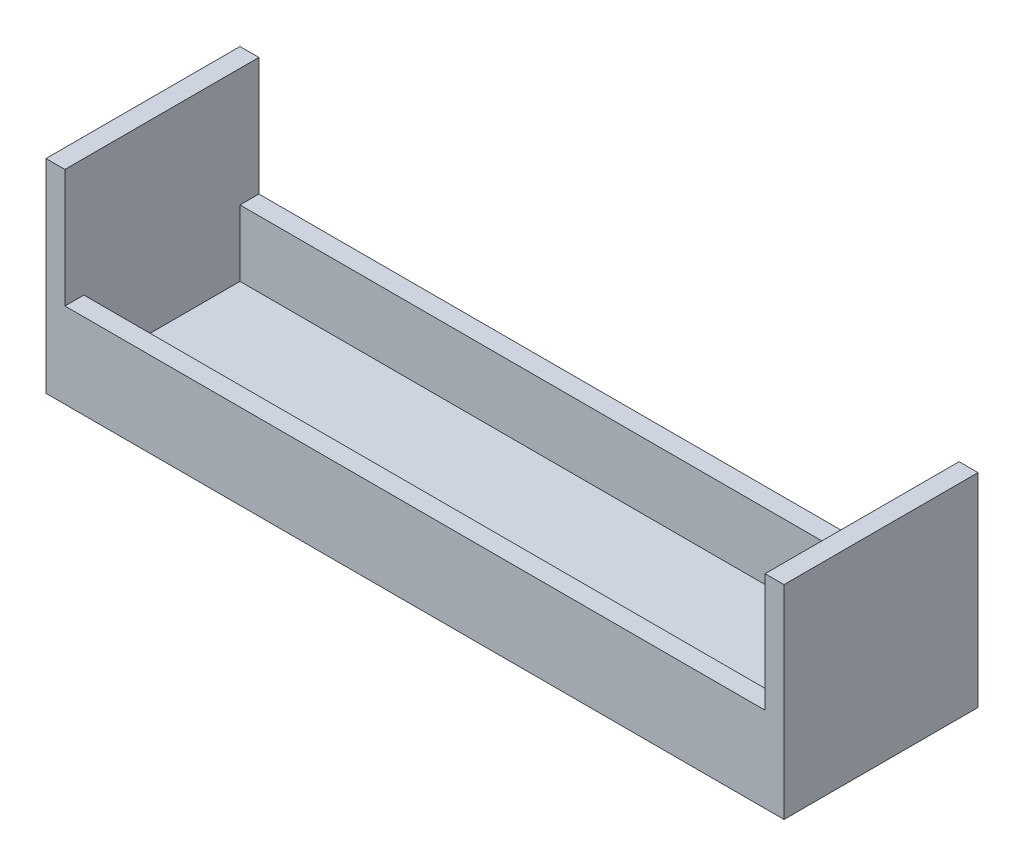
ISO-10303-21;
HEADER;
FILE_DESCRIPTION(('STEP AP214'),'2;1');
FILE_NAME('part.step','',(''),(''),'','','');
FILE_SCHEMA(('AUTOMOTIVE_DESIGN { 1 0 10303 214 1 1 1 1 }'));
ENDSEC;
DATA;
#1=APPLICATION_CONTEXT('core data for automotive mechanical design processes');
#2=APPLICATION_PROTOCOL_DEFINITION('international standard','automotive_design',2000,#1);
#3=PRODUCT_CONTEXT('',#1,'mechanical');
#4=PRODUCT('Part','Part','',(#3));
#5=PRODUCT_RELATED_PRODUCT_CATEGORY('part','',(#4));
#6=PRODUCT_DEFINITION_FORMATION('','',#4);
#7=PRODUCT_DEFINITION_CONTEXT('part definition',#1,'design');
#8=PRODUCT_DEFINITION('design','',#6,#7);
#9=PRODUCT_DEFINITION_SHAPE('','',#8);
#10=(LENGTH_UNIT() NAMED_UNIT(*) SI_UNIT(.MILLI.,.METRE.));
#11=(NAMED_UNIT(*) PLANE_ANGLE_UNIT() SI_UNIT($,.RADIAN.));
#12=(NAMED_UNIT(*) SI_UNIT($,.STERADIAN.) SOLID_ANGLE_UNIT());
#13=UNCERTAINTY_MEASURE_WITH_UNIT(LENGTH_MEASURE(1.E-05),#10,'distance_accuracy_value','');
#14=(GEOMETRIC_REPRESENTATION_CONTEXT(3) GLOBAL_UNCERTAINTY_ASSIGNED_CONTEXT((#13)) GLOBAL_UNIT_ASSIGNED_CONTEXT((#10,
#11,#12)) REPRESENTATION_CONTEXT('',''));
#15=CARTESIAN_POINT('',(0.,0.,0.));
#16=DIRECTION('',(0.,0.,1.));
#17=DIRECTION('',(1.,0.,0.));
#18=AXIS2_PLACEMENT_3D('',#15,#16,#17);
#19=CARTESIAN_POINT('',(0.,21.5,0.));
#20=DIRECTION('',(0.,-1.,0.));
#21=DIRECTION('',(0.,0.,-1.));
#22=AXIS2_PLACEMENT_3D('',#19,#20,#21);
#23=PLANE('',#22);
#24=DIRECTION('',(1.,0.,0.));
#25=VECTOR('',#24,1.);
#26=CARTESIAN_POINT('',(-39.,21.5,10.25));
#27=LINE('',#26,#25);
#28=CARTESIAN_POINT('',(-39.,21.5,10.25));
#29=VERTEX_POINT('',#28);
#30=CARTESIAN_POINT('',(-37.,21.5,10.25));
#31=VERTEX_POINT('',#30);
#32=EDGE_CURVE('E193',#29,#31,#27,.T.);
#33=ORIENTED_EDGE('',*,*,#32,.T.);
#34=DIRECTION('',(0.,0.,1.));
#35=VECTOR('',#34,1.);
#36=CARTESIAN_POINT('',(-37.,21.5,0.));
#37=LINE('',#36,#35);
#38=CARTESIAN_POINT('',(-37.,21.5,-10.25));
#39=VERTEX_POINT('',#38);
#40=EDGE_CURVE('E134',#39,#31,#37,.T.);
#41=ORIENTED_EDGE('',*,*,#40,.F.);
#42=DIRECTION('',(-1.,0.,0.));
#43=VECTOR('',#42,1.);
#44=CARTESIAN_POINT('',(-39.,21.5,-10.25));
#45=LINE('',#44,#43);
#46=CARTESIAN_POINT('',(-39.,21.5,-10.25));
#47=VERTEX_POINT('',#46);
#48=EDGE_CURVE('E185',#39,#47,#45,.T.);
#49=ORIENTED_EDGE('',*,*,#48,.T.);
#50=DIRECTION('',(0.,0.,1.));
#51=VECTOR('',#50,1.);
#52=CARTESIAN_POINT('',(-39.,21.5,10.25));
#53=LINE('',#52,#51);
#54=EDGE_CURVE('E190',#47,#29,#53,.T.);
#55=ORIENTED_EDGE('',*,*,#54,.T.);
#56=EDGE_LOOP('',(#33,#41,#49,#55));
#57=FACE_BOUND('',#56,.T.);
#58=ADVANCED_FACE('F33',(#57),#23,.F.);
#59=CARTESIAN_POINT('',(39.,21.5,-10.25));
#60=VERTEX_POINT('',#59);
#61=CARTESIAN_POINT('',(37.,21.5,-10.25));
#62=VERTEX_POINT('',#61);
#63=EDGE_CURVE('E187',#60,#62,#45,.T.);
#64=ORIENTED_EDGE('',*,*,#63,.T.);
#65=DIRECTION('',(0.,0.,-1.));
#66=VECTOR('',#65,1.);
#67=CARTESIAN_POINT('',(37.,21.5,0.));
#68=LINE('',#67,#66);
#69=CARTESIAN_POINT('',(37.,21.5,10.25));
#70=VERTEX_POINT('',#69);
#71=EDGE_CURVE('E179',#70,#62,#68,.T.);
#72=ORIENTED_EDGE('',*,*,#71,.F.);
#73=CARTESIAN_POINT('',(39.,21.5,10.25));
#74=VERTEX_POINT('',#73);
#75=EDGE_CURVE('E192',#70,#74,#27,.T.);
#76=ORIENTED_EDGE('',*,*,#75,.T.);
#77=DIRECTION('',(0.,0.,-1.));
#78=VECTOR('',#77,1.);
#79=CARTESIAN_POINT('',(39.,21.5,10.25));
#80=LINE('',#79,#78);
#81=EDGE_CURVE('E182',#74,#60,#80,.T.);
#82=ORIENTED_EDGE('',*,*,#81,.T.);
#83=EDGE_LOOP('',(#64,#72,#76,#82));
#84=FACE_BOUND('',#83,.T.);
#85=ADVANCED_FACE('F251',(#84),#23,.F.);
#86=CARTESIAN_POINT('',(39.,21.5,10.25));
#87=DIRECTION('',(-1.,0.,0.));
#88=DIRECTION('',(0.,0.,1.));
#89=AXIS2_PLACEMENT_3D('',#86,#87,#88);
#90=PLANE('',#89);
#91=DIRECTION('',(0.,0.,-1.));
#92=VECTOR('',#91,1.);
#93=CARTESIAN_POINT('',(39.,0.,10.25));
#94=LINE('',#93,#92);
#95=CARTESIAN_POINT('',(39.,0.,10.25));
#96=VERTEX_POINT('',#95);
#97=CARTESIAN_POINT('',(39.,0.,-10.25));
#98=VERTEX_POINT('',#97);
#99=EDGE_CURVE('E164',#96,#98,#94,.T.);
#100=ORIENTED_EDGE('',*,*,#99,.T.);
#101=DIRECTION('',(0.,-1.,0.));
#102=VECTOR('',#101,1.);
#103=CARTESIAN_POINT('',(39.,21.5,-10.25));
#104=LINE('',#103,#102);
#105=EDGE_CURVE('E41',#60,#98,#104,.T.);
#106=ORIENTED_EDGE('',*,*,#105,.F.);
#107=ORIENTED_EDGE('',*,*,#81,.F.);
#108=DIRECTION('',(0.,-1.,0.));
#109=VECTOR('',#108,1.);
#110=CARTESIAN_POINT('',(39.,21.5,10.25));
#111=LINE('',#110,#109);
#112=EDGE_CURVE('E195',#74,#96,#111,.T.);
#113=ORIENTED_EDGE('',*,*,#112,.T.);
#114=EDGE_LOOP('',(#100,#106,#107,#113));
#115=FACE_BOUND('',#114,.T.);
#116=ADVANCED_FACE('F35',(#115),#90,.F.);
#117=CARTESIAN_POINT('',(-39.,21.5,-10.25));
#118=DIRECTION('',(0.,0.,1.));
#119=DIRECTION('',(1.,0.,0.));
#120=AXIS2_PLACEMENT_3D('',#117,#118,#119);
#121=PLANE('',#120);
#122=ORIENTED_EDGE('',*,*,#48,.F.);
#123=DIRECTION('',(0.,-1.,0.));
#124=VECTOR('',#123,1.);
#125=CARTESIAN_POINT('',(-37.,21.5,-10.25));
#126=LINE('',#125,#124);
#127=CARTESIAN_POINT('',(-37.,9.,-10.25));
#128=VERTEX_POINT('',#127);
#129=EDGE_CURVE('E155',#39,#128,#126,.T.);
#130=ORIENTED_EDGE('',*,*,#129,.T.);
#131=DIRECTION('',(1.,0.,0.));
#132=VECTOR('',#131,1.);
#133=CARTESIAN_POINT('',(-39.,9.,-10.25));
#134=LINE('',#133,#132);
#135=CARTESIAN_POINT('',(37.,9.,-10.25));
#136=VERTEX_POINT('',#135);
#137=EDGE_CURVE('E149',#128,#136,#134,.T.);
#138=ORIENTED_EDGE('',*,*,#137,.T.);
#139=DIRECTION('',(0.,1.,0.));
#140=VECTOR('',#139,1.);
#141=CARTESIAN_POINT('',(37.,21.5,-10.25));
#142=LINE('',#141,#140);
#143=EDGE_CURVE('E152',#136,#62,#142,.T.);
#144=ORIENTED_EDGE('',*,*,#143,.T.);
#145=ORIENTED_EDGE('',*,*,#63,.F.);
#146=ORIENTED_EDGE('',*,*,#105,.T.);
#147=DIRECTION('',(-1.,0.,0.));
#148=VECTOR('',#147,1.);
#149=CARTESIAN_POINT('',(-39.,0.,-10.25));
#150=LINE('',#149,#148);
#151=CARTESIAN_POINT('',(-39.,0.,-10.25));
#152=VERTEX_POINT('',#151);
#153=EDGE_CURVE('E198',#98,#152,#150,.T.);
#154=ORIENTED_EDGE('',*,*,#153,.T.);
#155=DIRECTION('',(0.,-1.,0.));
#156=VECTOR('',#155,1.);
#157=CARTESIAN_POINT('',(-39.,21.5,-10.25));
#158=LINE('',#157,#156);
#159=EDGE_CURVE('E208',#47,#152,#158,.T.);
#160=ORIENTED_EDGE('',*,*,#159,.F.);
#161=EDGE_LOOP('',(#122,#130,#138,#144,#145,#146,#154,#160));
#162=FACE_BOUND('',#161,.T.);
#163=ADVANCED_FACE('F214',(#162),#121,.F.);
#164=CARTESIAN_POINT('',(-39.,21.5,10.25));
#165=DIRECTION('',(1.,0.,0.));
#166=DIRECTION('',(0.,0.,-1.));
#167=AXIS2_PLACEMENT_3D('',#164,#165,#166);
#168=PLANE('',#167);
#169=DIRECTION('',(0.,0.,1.));
#170=VECTOR('',#169,1.);
#171=CARTESIAN_POINT('',(-39.,0.,10.25));
#172=LINE('',#171,#170);
#173=CARTESIAN_POINT('',(-39.,0.,10.25));
#174=VERTEX_POINT('',#173);
#175=EDGE_CURVE('E200',#152,#174,#172,.T.);
#176=ORIENTED_EDGE('',*,*,#175,.T.);
#177=DIRECTION('',(0.,-1.,0.));
#178=VECTOR('',#177,1.);
#179=CARTESIAN_POINT('',(-39.,21.5,10.25));
#180=LINE('',#179,#178);
#181=EDGE_CURVE('E205',#29,#174,#180,.T.);
#182=ORIENTED_EDGE('',*,*,#181,.F.);
#183=ORIENTED_EDGE('',*,*,#54,.F.);
#184=ORIENTED_EDGE('',*,*,#159,.T.);
#185=EDGE_LOOP('',(#176,#182,#183,#184));
#186=FACE_BOUND('',#185,.T.);
#187=ADVANCED_FACE('F226',(#186),#168,.F.);
#188=CARTESIAN_POINT('',(-39.,21.5,10.25));
#189=DIRECTION('',(0.,0.,-1.));
#190=DIRECTION('',(-1.,0.,0.));
#191=AXIS2_PLACEMENT_3D('',#188,#189,#190);
#192=PLANE('',#191);
#193=DIRECTION('',(1.,0.,0.));
#194=VECTOR('',#193,1.);
#195=CARTESIAN_POINT('',(-37.,9.,10.25));
#196=LINE('',#195,#194);
#197=CARTESIAN_POINT('',(-37.,9.,10.25));
#198=VERTEX_POINT('',#197);
#199=CARTESIAN_POINT('',(37.,9.,10.25));
#200=VERTEX_POINT('',#199);
#201=EDGE_CURVE('E123',#198,#200,#196,.T.);
#202=ORIENTED_EDGE('',*,*,#201,.F.);
#203=DIRECTION('',(0.,-1.,0.));
#204=VECTOR('',#203,1.);
#205=CARTESIAN_POINT('',(-37.,21.5,10.25));
#206=LINE('',#205,#204);
#207=EDGE_CURVE('E130',#31,#198,#206,.T.);
#208=ORIENTED_EDGE('',*,*,#207,.F.);
#209=ORIENTED_EDGE('',*,*,#32,.F.);
#210=ORIENTED_EDGE('',*,*,#181,.T.);
#211=DIRECTION('',(1.,0.,0.));
#212=VECTOR('',#211,1.);
#213=CARTESIAN_POINT('',(-39.,0.,10.25));
#214=LINE('',#213,#212);
#215=EDGE_CURVE('E186',#174,#96,#214,.T.);
#216=ORIENTED_EDGE('',*,*,#215,.T.);
#217=ORIENTED_EDGE('',*,*,#112,.F.);
#218=ORIENTED_EDGE('',*,*,#75,.F.);
#219=DIRECTION('',(0.,1.,0.));
#220=VECTOR('',#219,1.);
#221=CARTESIAN_POINT('',(37.,21.5,10.25));
#222=LINE('',#221,#220);
#223=EDGE_CURVE('E127',#200,#70,#222,.T.);
#224=ORIENTED_EDGE('',*,*,#223,.F.);
#225=EDGE_LOOP('',(#202,#208,#209,#210,#216,#217,#218,#224));
#226=FACE_BOUND('',#225,.T.);
#227=ADVANCED_FACE('F139',(#226),#192,.F.);
#228=CARTESIAN_POINT('',(0.,0.,0.));
#229=DIRECTION('',(0.,-1.,0.));
#230=DIRECTION('',(0.,0.,-1.));
#231=AXIS2_PLACEMENT_3D('',#228,#229,#230);
#232=PLANE('',#231);
#233=ORIENTED_EDGE('',*,*,#99,.F.);
#234=ORIENTED_EDGE('',*,*,#215,.F.);
#235=ORIENTED_EDGE('',*,*,#175,.F.);
#236=ORIENTED_EDGE('',*,*,#153,.F.);
#237=EDGE_LOOP('',(#233,#234,#235,#236));
#238=FACE_BOUND('',#237,.T.);
#239=ADVANCED_FACE('F222',(#238),#232,.T.);
#240=CARTESIAN_POINT('',(37.,21.5,10.25));
#241=DIRECTION('',(-1.,0.,0.));
#242=DIRECTION('',(0.,0.,1.));
#243=AXIS2_PLACEMENT_3D('',#240,#241,#242);
#244=PLANE('',#243);
#245=DIRECTION('',(0.,-1.,0.));
#246=VECTOR('',#245,1.);
#247=CARTESIAN_POINT('',(37.,21.5,8.25));
#248=LINE('',#247,#246);
#249=CARTESIAN_POINT('',(37.,9.,8.25));
#250=VERTEX_POINT('',#249);
#251=CARTESIAN_POINT('',(37.,2.,8.25));
#252=VERTEX_POINT('',#251);
#253=EDGE_CURVE('E166',#250,#252,#248,.T.);
#254=ORIENTED_EDGE('',*,*,#253,.F.);
#255=DIRECTION('',(0.,0.,1.));
#256=VECTOR('',#255,1.);
#257=CARTESIAN_POINT('',(37.,9.,-31.25));
#258=LINE('',#257,#256);
#259=EDGE_CURVE('E55',#250,#200,#258,.T.);
#260=ORIENTED_EDGE('',*,*,#259,.T.);
#261=ORIENTED_EDGE('',*,*,#223,.T.);
#262=ORIENTED_EDGE('',*,*,#71,.T.);
#263=ORIENTED_EDGE('',*,*,#143,.F.);
#264=CARTESIAN_POINT('',(37.,9.,-8.25));
#265=VERTEX_POINT('',#264);
#266=EDGE_CURVE('E145',#136,#265,#258,.T.);
#267=ORIENTED_EDGE('',*,*,#266,.T.);
#268=DIRECTION('',(0.,-1.,0.));
#269=VECTOR('',#268,1.);
#270=CARTESIAN_POINT('',(37.,21.5,-8.25));
#271=LINE('',#270,#269);
#272=CARTESIAN_POINT('',(37.,2.,-8.25));
#273=VERTEX_POINT('',#272);
#274=EDGE_CURVE('E162',#265,#273,#271,.T.);
#275=ORIENTED_EDGE('',*,*,#274,.T.);
#276=DIRECTION('',(0.,0.,-1.));
#277=VECTOR('',#276,1.);
#278=CARTESIAN_POINT('',(37.,2.,0.));
#279=LINE('',#278,#277);
#280=EDGE_CURVE('E158',#252,#273,#279,.T.);
#281=ORIENTED_EDGE('',*,*,#280,.F.);
#282=EDGE_LOOP('',(#254,#260,#261,#262,#263,#267,#275,#281));
#283=FACE_BOUND('',#282,.T.);
#284=ADVANCED_FACE('F240',(#283),#244,.T.);
#285=CARTESIAN_POINT('',(-39.,21.5,-8.25));
#286=DIRECTION('',(0.,0.,1.));
#287=DIRECTION('',(1.,0.,0.));
#288=AXIS2_PLACEMENT_3D('',#285,#286,#287);
#289=PLANE('',#288);
#290=DIRECTION('',(1.,0.,0.));
#291=VECTOR('',#290,1.);
#292=CARTESIAN_POINT('',(-39.,9.,-8.25));
#293=LINE('',#292,#291);
#294=CARTESIAN_POINT('',(-37.,9.,-8.25));
#295=VERTEX_POINT('',#294);
#296=EDGE_CURVE('E147',#295,#265,#293,.T.);
#297=ORIENTED_EDGE('',*,*,#296,.F.);
#298=DIRECTION('',(0.,-1.,0.));
#299=VECTOR('',#298,1.);
#300=CARTESIAN_POINT('',(-37.,21.5,-8.25));
#301=LINE('',#300,#299);
#302=CARTESIAN_POINT('',(-37.,2.,-8.25));
#303=VERTEX_POINT('',#302);
#304=EDGE_CURVE('E165',#295,#303,#301,.T.);
#305=ORIENTED_EDGE('',*,*,#304,.T.);
#306=DIRECTION('',(-1.,0.,0.));
#307=VECTOR('',#306,1.);
#308=CARTESIAN_POINT('',(0.,2.,-8.25));
#309=LINE('',#308,#307);
#310=EDGE_CURVE('E161',#273,#303,#309,.T.);
#311=ORIENTED_EDGE('',*,*,#310,.F.);
#312=ORIENTED_EDGE('',*,*,#274,.F.);
#313=EDGE_LOOP('',(#297,#305,#311,#312));
#314=FACE_BOUND('',#313,.T.);
#315=ADVANCED_FACE('F232',(#314),#289,.T.);
#316=CARTESIAN_POINT('',(-37.,21.5,10.25));
#317=DIRECTION('',(1.,0.,0.));
#318=DIRECTION('',(0.,0.,-1.));
#319=AXIS2_PLACEMENT_3D('',#316,#317,#318);
#320=PLANE('',#319);
#321=ORIENTED_EDGE('',*,*,#304,.F.);
#322=DIRECTION('',(0.,0.,1.));
#323=VECTOR('',#322,1.);
#324=CARTESIAN_POINT('',(-37.,9.,-31.25));
#325=LINE('',#324,#323);
#326=EDGE_CURVE('E48',#128,#295,#325,.T.);
#327=ORIENTED_EDGE('',*,*,#326,.F.);
#328=ORIENTED_EDGE('',*,*,#129,.F.);
#329=ORIENTED_EDGE('',*,*,#40,.T.);
#330=ORIENTED_EDGE('',*,*,#207,.T.);
#331=CARTESIAN_POINT('',(-37.,9.,8.25));
#332=VERTEX_POINT('',#331);
#333=EDGE_CURVE('E119',#332,#198,#325,.T.);
#334=ORIENTED_EDGE('',*,*,#333,.F.);
#335=DIRECTION('',(0.,-1.,0.));
#336=VECTOR('',#335,1.);
#337=CARTESIAN_POINT('',(-37.,21.5,8.25));
#338=LINE('',#337,#336);
#339=CARTESIAN_POINT('',(-37.,2.,8.25));
#340=VERTEX_POINT('',#339);
#341=EDGE_CURVE('E168',#332,#340,#338,.T.);
#342=ORIENTED_EDGE('',*,*,#341,.T.);
#343=DIRECTION('',(0.,0.,1.));
#344=VECTOR('',#343,1.);
#345=CARTESIAN_POINT('',(-37.,2.,0.));
#346=LINE('',#345,#344);
#347=EDGE_CURVE('E171',#303,#340,#346,.T.);
#348=ORIENTED_EDGE('',*,*,#347,.F.);
#349=EDGE_LOOP('',(#321,#327,#328,#329,#330,#334,#342,#348));
#350=FACE_BOUND('',#349,.T.);
#351=ADVANCED_FACE('F132',(#350),#320,.T.);
#352=CARTESIAN_POINT('',(-39.,21.5,8.25));
#353=DIRECTION('',(0.,0.,-1.));
#354=DIRECTION('',(-1.,0.,0.));
#355=AXIS2_PLACEMENT_3D('',#352,#353,#354);
#356=PLANE('',#355);
#357=DIRECTION('',(-1.,0.,0.));
#358=VECTOR('',#357,1.);
#359=CARTESIAN_POINT('',(-39.,9.,8.25));
#360=LINE('',#359,#358);
#361=EDGE_CURVE('E11',#250,#332,#360,.T.);
#362=ORIENTED_EDGE('',*,*,#361,.F.);
#363=ORIENTED_EDGE('',*,*,#253,.T.);
#364=DIRECTION('',(1.,0.,0.));
#365=VECTOR('',#364,1.);
#366=CARTESIAN_POINT('',(0.,2.,8.25));
#367=LINE('',#366,#365);
#368=EDGE_CURVE('E175',#340,#252,#367,.T.);
#369=ORIENTED_EDGE('',*,*,#368,.F.);
#370=ORIENTED_EDGE('',*,*,#341,.F.);
#371=EDGE_LOOP('',(#362,#363,#369,#370));
#372=FACE_BOUND('',#371,.T.);
#373=ADVANCED_FACE('F317',(#372),#356,.T.);
#374=CARTESIAN_POINT('',(0.,2.,0.));
#375=DIRECTION('',(0.,-1.,0.));
#376=DIRECTION('',(0.,0.,-1.));
#377=AXIS2_PLACEMENT_3D('',#374,#375,#376);
#378=PLANE('',#377);
#379=ORIENTED_EDGE('',*,*,#280,.T.);
#380=ORIENTED_EDGE('',*,*,#310,.T.);
#381=ORIENTED_EDGE('',*,*,#347,.T.);
#382=ORIENTED_EDGE('',*,*,#368,.T.);
#383=EDGE_LOOP('',(#379,#380,#381,#382));
#384=FACE_BOUND('',#383,.T.);
#385=ADVANCED_FACE('F235',(#384),#378,.F.);
#386=CARTESIAN_POINT('',(-37.,9.,-31.25));
#387=DIRECTION('',(0.,-1.,0.));
#388=DIRECTION('',(0.,0.,-1.));
#389=AXIS2_PLACEMENT_3D('',#386,#387,#388);
#390=PLANE('',#389);
#391=ORIENTED_EDGE('',*,*,#361,.T.);
#392=ORIENTED_EDGE('',*,*,#333,.T.);
#393=ORIENTED_EDGE('',*,*,#201,.T.);
#394=ORIENTED_EDGE('',*,*,#259,.F.);
#395=EDGE_LOOP('',(#391,#392,#393,#394));
#396=FACE_BOUND('',#395,.T.);
#397=ADVANCED_FACE('F121',(#396),#390,.F.);
#398=ORIENTED_EDGE('',*,*,#326,.T.);
#399=ORIENTED_EDGE('',*,*,#296,.T.);
#400=ORIENTED_EDGE('',*,*,#266,.F.);
#401=ORIENTED_EDGE('',*,*,#137,.F.);
#402=EDGE_LOOP('',(#398,#399,#400,#401));
#403=FACE_BOUND('',#402,.T.);
#404=ADVANCED_FACE('F243',(#403),#390,.F.);
#405=CLOSED_SHELL('',(#58,#85,#116,#163,#187,#227,#239,#284,#315,#351,#373,#385,#397,#404));
#406=MANIFOLD_SOLID_BREP('B2',#405);
#407=ADVANCED_BREP_SHAPE_REPRESENTATION('',(#18,#406),#14);
#408=SHAPE_DEFINITION_REPRESENTATION(#9,#407);
ENDSEC;
END-ISO-10303-21;
